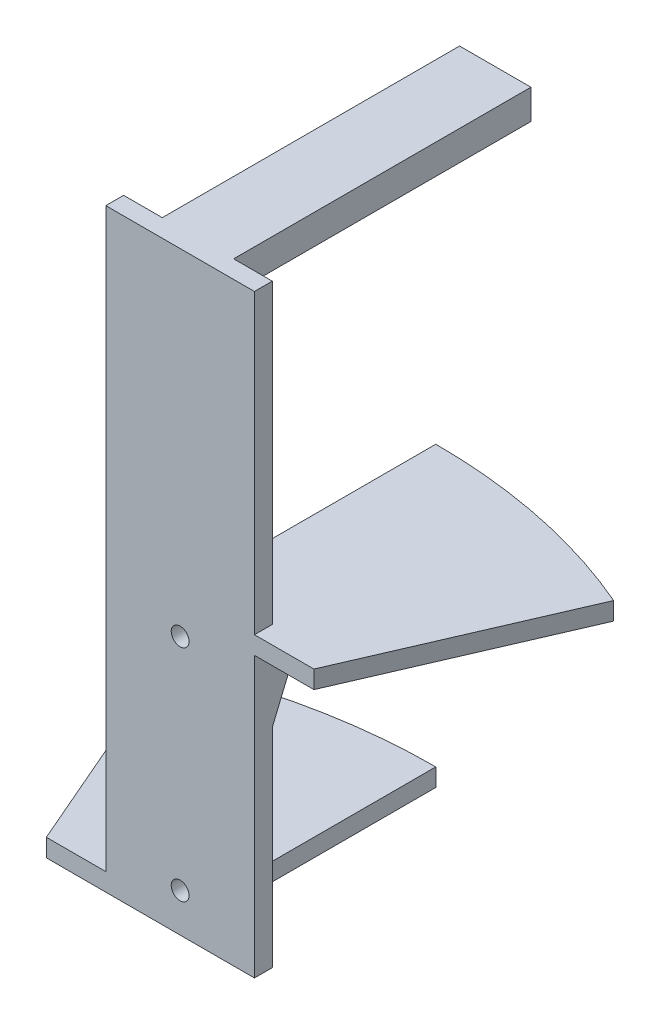
ISO-10303-21;
HEADER;
FILE_DESCRIPTION(('STEP AP214'),'2;1');
FILE_NAME('part.step','',(''),(''),'','','');
FILE_SCHEMA(('AUTOMOTIVE_DESIGN { 1 0 10303 214 1 1 1 1 }'));
ENDSEC;
DATA;
#1=APPLICATION_CONTEXT('core data for automotive mechanical design processes');
#2=APPLICATION_PROTOCOL_DEFINITION('international standard','automotive_design',2000,#1);
#3=PRODUCT_CONTEXT('',#1,'mechanical');
#4=PRODUCT('Part','Part','',(#3));
#5=PRODUCT_RELATED_PRODUCT_CATEGORY('part','',(#4));
#6=PRODUCT_DEFINITION_FORMATION('','',#4);
#7=PRODUCT_DEFINITION_CONTEXT('part definition',#1,'design');
#8=PRODUCT_DEFINITION('design','',#6,#7);
#9=PRODUCT_DEFINITION_SHAPE('','',#8);
#10=(LENGTH_UNIT() NAMED_UNIT(*) SI_UNIT(.MILLI.,.METRE.));
#11=(NAMED_UNIT(*) PLANE_ANGLE_UNIT() SI_UNIT($,.RADIAN.));
#12=(NAMED_UNIT(*) SI_UNIT($,.STERADIAN.) SOLID_ANGLE_UNIT());
#13=UNCERTAINTY_MEASURE_WITH_UNIT(LENGTH_MEASURE(1.E-05),#10,'distance_accuracy_value','');
#14=(GEOMETRIC_REPRESENTATION_CONTEXT(3) GLOBAL_UNCERTAINTY_ASSIGNED_CONTEXT((#13)) GLOBAL_UNIT_ASSIGNED_CONTEXT((#10,
#11,#12)) REPRESENTATION_CONTEXT('',''));
#15=CARTESIAN_POINT('',(0.,0.,0.));
#16=DIRECTION('',(0.,0.,1.));
#17=DIRECTION('',(1.,0.,0.));
#18=AXIS2_PLACEMENT_3D('',#15,#16,#17);
#19=CARTESIAN_POINT('',(0.,0.,0.));
#20=DIRECTION('',(0.,0.,-1.));
#21=DIRECTION('',(-1.,0.,0.));
#22=AXIS2_PLACEMENT_3D('',#19,#20,#21);
#23=PLANE('',#22);
#24=CARTESIAN_POINT('',(0.,18.5,0.));
#25=DIRECTION('',(0.,0.,1.));
#26=DIRECTION('',(1.,0.,0.));
#27=AXIS2_PLACEMENT_3D('',#24,#25,#26);
#28=CIRCLE('',#27,1.5);
#29=CARTESIAN_POINT('',(1.5,18.5,0.));
#30=VERTEX_POINT('',#29);
#31=EDGE_CURVE('E406',#30,#30,#28,.T.);
#32=ORIENTED_EDGE('',*,*,#31,.T.);
#33=EDGE_LOOP('',(#32));
#34=FACE_BOUND('',#33,.T.);
#35=CARTESIAN_POINT('',(0.,-18.5,0.));
#36=DIRECTION('',(0.,0.,1.));
#37=DIRECTION('',(-1.,0.,0.));
#38=AXIS2_PLACEMENT_3D('',#35,#36,#37);
#39=CIRCLE('',#38,1.5);
#40=CARTESIAN_POINT('',(-1.49999999999999,-18.5,0.));
#41=VERTEX_POINT('',#40);
#42=EDGE_CURVE('E402',#41,#41,#39,.T.);
#43=ORIENTED_EDGE('',*,*,#42,.T.);
#44=EDGE_LOOP('',(#43));
#45=FACE_BOUND('',#44,.T.);
#46=DIRECTION('',(-1.,0.,0.));
#47=VECTOR('',#46,1.);
#48=CARTESIAN_POINT('',(-6.,25.,0.));
#49=LINE('',#48,#47);
#50=CARTESIAN_POINT('',(-2.99999999999999,25.,0.));
#51=VERTEX_POINT('',#50);
#52=CARTESIAN_POINT('',(-6.,25.,0.));
#53=VERTEX_POINT('',#52);
#54=EDGE_CURVE('E240',#51,#53,#49,.T.);
#55=ORIENTED_EDGE('',*,*,#54,.F.);
#56=DIRECTION('',(0.,-1.,0.));
#57=VECTOR('',#56,1.);
#58=CARTESIAN_POINT('',(-3.,70.,0.));
#59=LINE('',#58,#57);
#60=CARTESIAN_POINT('',(-3.,70.,0.));
#61=VERTEX_POINT('',#60);
#62=EDGE_CURVE('E493',#61,#51,#59,.T.);
#63=ORIENTED_EDGE('',*,*,#62,.F.);
#64=DIRECTION('',(-1.,0.,0.));
#65=VECTOR('',#64,1.);
#66=CARTESIAN_POINT('',(6.,70.,0.));
#67=LINE('',#66,#65);
#68=CARTESIAN_POINT('',(3.,70.,0.));
#69=VERTEX_POINT('',#68);
#70=EDGE_CURVE('E245',#69,#61,#67,.T.);
#71=ORIENTED_EDGE('',*,*,#70,.F.);
#72=DIRECTION('',(0.,1.,0.));
#73=VECTOR('',#72,1.);
#74=CARTESIAN_POINT('',(3.,70.,0.));
#75=LINE('',#74,#73);
#76=CARTESIAN_POINT('',(2.99999999999999,25.,0.));
#77=VERTEX_POINT('',#76);
#78=EDGE_CURVE('E246',#77,#69,#75,.T.);
#79=ORIENTED_EDGE('',*,*,#78,.F.);
#80=DIRECTION('',(-1.,0.,0.));
#81=VECTOR('',#80,1.);
#82=CARTESIAN_POINT('',(12.5,25.,0.));
#83=LINE('',#82,#81);
#84=CARTESIAN_POINT('',(0.,25.,0.));
#85=VERTEX_POINT('',#84);
#86=EDGE_CURVE('E305',#77,#85,#83,.T.);
#87=ORIENTED_EDGE('',*,*,#86,.T.);
#88=DIRECTION('',(0.,1.,0.));
#89=VECTOR('',#88,1.);
#90=CARTESIAN_POINT('',(0.,22.,0.));
#91=LINE('',#90,#89);
#92=CARTESIAN_POINT('',(0.,22.,0.));
#93=VERTEX_POINT('',#92);
#94=EDGE_CURVE('E339',#93,#85,#91,.T.);
#95=ORIENTED_EDGE('',*,*,#94,.F.);
#96=DIRECTION('',(1.,0.,0.));
#97=VECTOR('',#96,1.);
#98=CARTESIAN_POINT('',(0.,22.,0.));
#99=LINE('',#98,#97);
#100=CARTESIAN_POINT('',(9.5,22.,0.));
#101=VERTEX_POINT('',#100);
#102=EDGE_CURVE('E399',#93,#101,#99,.T.);
#103=ORIENTED_EDGE('',*,*,#102,.T.);
#104=DIRECTION('',(0.,-1.,0.));
#105=VECTOR('',#104,1.);
#106=CARTESIAN_POINT('',(9.5,0.,0.));
#107=LINE('',#106,#105);
#108=CARTESIAN_POINT('',(9.5,10.,0.));
#109=VERTEX_POINT('',#108);
#110=EDGE_CURVE('E317',#101,#109,#107,.T.);
#111=ORIENTED_EDGE('',*,*,#110,.T.);
#112=DIRECTION('',(1.,0.,0.));
#113=VECTOR('',#112,1.);
#114=CARTESIAN_POINT('',(0.,10.,0.));
#115=LINE('',#114,#113);
#116=CARTESIAN_POINT('',(12.5,10.,0.));
#117=VERTEX_POINT('',#116);
#118=EDGE_CURVE('E321',#117,#109,#115,.F.);
#119=ORIENTED_EDGE('',*,*,#118,.F.);
#120=DIRECTION('',(0.,1.,0.));
#121=VECTOR('',#120,1.);
#122=CARTESIAN_POINT('',(12.5,25.,0.));
#123=LINE('',#122,#121);
#124=CARTESIAN_POINT('',(12.5,-25.,0.));
#125=VERTEX_POINT('',#124);
#126=EDGE_CURVE('E418',#125,#117,#123,.T.);
#127=ORIENTED_EDGE('',*,*,#126,.F.);
#128=DIRECTION('',(-1.,0.,0.));
#129=VECTOR('',#128,1.);
#130=CARTESIAN_POINT('',(0.,-25.,0.));
#131=LINE('',#130,#129);
#132=CARTESIAN_POINT('',(0.,-25.,0.));
#133=VERTEX_POINT('',#132);
#134=EDGE_CURVE('E348',#125,#133,#131,.T.);
#135=ORIENTED_EDGE('',*,*,#134,.T.);
#136=DIRECTION('',(0.,-1.,0.));
#137=VECTOR('',#136,1.);
#138=CARTESIAN_POINT('',(0.,-22.,0.));
#139=LINE('',#138,#137);
#140=CARTESIAN_POINT('',(0.,-22.,0.));
#141=VERTEX_POINT('',#140);
#142=EDGE_CURVE('E347',#141,#133,#139,.T.);
#143=ORIENTED_EDGE('',*,*,#142,.F.);
#144=DIRECTION('',(-1.,0.,0.));
#145=VECTOR('',#144,1.);
#146=CARTESIAN_POINT('',(0.,-22.,0.));
#147=LINE('',#146,#145);
#148=CARTESIAN_POINT('',(-9.5,-22.,0.));
#149=VERTEX_POINT('',#148);
#150=EDGE_CURVE('E374',#141,#149,#147,.T.);
#151=ORIENTED_EDGE('',*,*,#150,.T.);
#152=DIRECTION('',(0.,1.,0.));
#153=VECTOR('',#152,1.);
#154=CARTESIAN_POINT('',(-9.5,0.,0.));
#155=LINE('',#154,#153);
#156=CARTESIAN_POINT('',(-9.5,-10.,0.));
#157=VERTEX_POINT('',#156);
#158=EDGE_CURVE('E328',#149,#157,#155,.T.);
#159=ORIENTED_EDGE('',*,*,#158,.T.);
#160=DIRECTION('',(-1.,0.,0.));
#161=VECTOR('',#160,1.);
#162=CARTESIAN_POINT('',(0.,-10.,0.));
#163=LINE('',#162,#161);
#164=CARTESIAN_POINT('',(-12.5,-10.,0.));
#165=VERTEX_POINT('',#164);
#166=EDGE_CURVE('E332',#165,#157,#163,.F.);
#167=ORIENTED_EDGE('',*,*,#166,.F.);
#168=DIRECTION('',(0.,-1.,0.));
#169=VECTOR('',#168,1.);
#170=CARTESIAN_POINT('',(-12.5,25.,0.));
#171=LINE('',#170,#169);
#172=CARTESIAN_POINT('',(-12.5,75.,0.));
#173=VERTEX_POINT('',#172);
#174=EDGE_CURVE('E412',#173,#165,#171,.T.);
#175=ORIENTED_EDGE('',*,*,#174,.F.);
#176=DIRECTION('',(-1.,0.,0.));
#177=VECTOR('',#176,1.);
#178=CARTESIAN_POINT('',(12.5,75.,0.));
#179=LINE('',#178,#177);
#180=CARTESIAN_POINT('',(-5.99999999999999,75.,0.));
#181=VERTEX_POINT('',#180);
#182=EDGE_CURVE('E298',#181,#173,#179,.T.);
#183=ORIENTED_EDGE('',*,*,#182,.F.);
#184=DIRECTION('',(0.,1.,0.));
#185=VECTOR('',#184,1.);
#186=CARTESIAN_POINT('',(-5.99999999999999,75.,0.));
#187=LINE('',#186,#185);
#188=EDGE_CURVE('E272',#53,#181,#187,.T.);
#189=ORIENTED_EDGE('',*,*,#188,.F.);
#190=EDGE_LOOP('',(#55,#63,#71,#79,#87,#95,#103,#111,#119,#127,#135,#143,#151,#159,#167,#175,
#183,#189));
#191=FACE_BOUND('',#190,.T.);
#192=ADVANCED_FACE('F35',(#34,#45,#191),#23,.T.);
#193=CARTESIAN_POINT('',(6.,70.,-50.));
#194=DIRECTION('',(0.,1.,0.));
#195=DIRECTION('',(0.,0.,1.));
#196=AXIS2_PLACEMENT_3D('',#193,#194,#195);
#197=PLANE('',#196);
#198=DIRECTION('',(0.,0.,1.));
#199=VECTOR('',#198,1.);
#200=CARTESIAN_POINT('',(-3.,70.,-3.));
#201=LINE('',#200,#199);
#202=CARTESIAN_POINT('',(-3.,70.,-3.));
#203=VERTEX_POINT('',#202);
#204=EDGE_CURVE('E224',#203,#61,#201,.T.);
#205=ORIENTED_EDGE('',*,*,#204,.F.);
#206=DIRECTION('',(1.,0.,0.));
#207=VECTOR('',#206,1.);
#208=CARTESIAN_POINT('',(-6.,70.,-3.));
#209=LINE('',#208,#207);
#210=CARTESIAN_POINT('',(-6.,70.,-3.));
#211=VERTEX_POINT('',#210);
#212=EDGE_CURVE('E231',#211,#203,#209,.T.);
#213=ORIENTED_EDGE('',*,*,#212,.F.);
#214=DIRECTION('',(0.,0.,1.));
#215=VECTOR('',#214,1.);
#216=CARTESIAN_POINT('',(-5.99999999999999,70.,-50.));
#217=LINE('',#216,#215);
#218=CARTESIAN_POINT('',(-5.99999999999999,70.,-50.));
#219=VERTEX_POINT('',#218);
#220=EDGE_CURVE('E284',#219,#211,#217,.T.);
#221=ORIENTED_EDGE('',*,*,#220,.F.);
#222=DIRECTION('',(-1.,0.,0.));
#223=VECTOR('',#222,1.);
#224=CARTESIAN_POINT('',(6.,70.,-50.));
#225=LINE('',#224,#223);
#226=CARTESIAN_POINT('',(6.,70.,-50.));
#227=VERTEX_POINT('',#226);
#228=EDGE_CURVE('E271',#227,#219,#225,.T.);
#229=ORIENTED_EDGE('',*,*,#228,.F.);
#230=DIRECTION('',(0.,0.,1.));
#231=VECTOR('',#230,1.);
#232=CARTESIAN_POINT('',(6.,70.,-50.));
#233=LINE('',#232,#231);
#234=CARTESIAN_POINT('',(6.,70.,-3.));
#235=VERTEX_POINT('',#234);
#236=EDGE_CURVE('E286',#227,#235,#233,.T.);
#237=ORIENTED_EDGE('',*,*,#236,.T.);
#238=DIRECTION('',(1.,0.,0.));
#239=VECTOR('',#238,1.);
#240=CARTESIAN_POINT('',(6.,70.,-3.));
#241=LINE('',#240,#239);
#242=CARTESIAN_POINT('',(2.99999999999999,70.,-3.));
#243=VERTEX_POINT('',#242);
#244=EDGE_CURVE('E259',#243,#235,#241,.T.);
#245=ORIENTED_EDGE('',*,*,#244,.F.);
#246=DIRECTION('',(0.,0.,1.));
#247=VECTOR('',#246,1.);
#248=CARTESIAN_POINT('',(3.,70.,-3.));
#249=LINE('',#248,#247);
#250=EDGE_CURVE('E50',#243,#69,#249,.T.);
#251=ORIENTED_EDGE('',*,*,#250,.T.);
#252=ORIENTED_EDGE('',*,*,#70,.T.);
#253=EDGE_LOOP('',(#205,#213,#221,#229,#237,#245,#251,#252));
#254=FACE_BOUND('',#253,.T.);
#255=ADVANCED_FACE('F243',(#254),#197,.F.);
#256=CARTESIAN_POINT('',(12.5,25.,0.));
#257=VERTEX_POINT('',#256);
#258=CARTESIAN_POINT('',(6.,25.,0.));
#259=VERTEX_POINT('',#258);
#260=EDGE_CURVE('E294',#257,#259,#83,.T.);
#261=ORIENTED_EDGE('',*,*,#260,.T.);
#262=DIRECTION('',(0.,-1.,0.));
#263=VECTOR('',#262,1.);
#264=CARTESIAN_POINT('',(6.,75.,0.));
#265=LINE('',#264,#263);
#266=CARTESIAN_POINT('',(6.,75.,0.));
#267=VERTEX_POINT('',#266);
#268=EDGE_CURVE('E267',#267,#259,#265,.T.);
#269=ORIENTED_EDGE('',*,*,#268,.F.);
#270=CARTESIAN_POINT('',(12.5,75.,0.));
#271=VERTEX_POINT('',#270);
#272=EDGE_CURVE('E299',#271,#267,#179,.T.);
#273=ORIENTED_EDGE('',*,*,#272,.F.);
#274=DIRECTION('',(0.,-1.,0.));
#275=VECTOR('',#274,1.);
#276=CARTESIAN_POINT('',(12.5,75.,0.));
#277=LINE('',#276,#275);
#278=EDGE_CURVE('E302',#271,#257,#277,.T.);
#279=ORIENTED_EDGE('',*,*,#278,.T.);
#280=EDGE_LOOP('',(#261,#269,#273,#279));
#281=FACE_BOUND('',#280,.T.);
#282=ADVANCED_FACE('F540',(#281),#23,.T.);
#283=CARTESIAN_POINT('',(12.5,25.,3.));
#284=DIRECTION('',(0.,-1.,0.));
#285=DIRECTION('',(1.,0.,0.));
#286=AXIS2_PLACEMENT_3D('',#283,#284,#285);
#287=PLANE('',#286);
#288=DIRECTION('',(0.,0.,1.));
#289=VECTOR('',#288,1.);
#290=CARTESIAN_POINT('',(6.,25.,-3.));
#291=LINE('',#290,#289);
#292=CARTESIAN_POINT('',(6.,25.,-3.));
#293=VERTEX_POINT('',#292);
#294=EDGE_CURVE('E264',#293,#259,#291,.T.);
#295=ORIENTED_EDGE('',*,*,#294,.T.);
#296=ORIENTED_EDGE('',*,*,#260,.F.);
#297=DIRECTION('',(0.,0.,-1.));
#298=VECTOR('',#297,1.);
#299=CARTESIAN_POINT('',(12.5,25.,0.));
#300=LINE('',#299,#298);
#301=CARTESIAN_POINT('',(12.5,25.,3.));
#302=VERTEX_POINT('',#301);
#303=EDGE_CURVE('E289',#302,#257,#300,.T.);
#304=ORIENTED_EDGE('',*,*,#303,.F.);
#305=DIRECTION('',(-1.,0.,0.));
#306=VECTOR('',#305,1.);
#307=CARTESIAN_POINT('',(12.5,25.,3.));
#308=LINE('',#307,#306);
#309=CARTESIAN_POINT('',(22.5,25.,2.99999999999999));
#310=VERTEX_POINT('',#309);
#311=EDGE_CURVE('E422',#310,#302,#308,.T.);
#312=ORIENTED_EDGE('',*,*,#311,.F.);
#313=DIRECTION('',(0.397112073095543,0.,-0.917770124487478));
#314=VECTOR('',#313,1.);
#315=CARTESIAN_POINT('',(22.5,25.,2.99999999999999));
#316=LINE('',#315,#314);
#317=CARTESIAN_POINT('',(37.7256469440766,25.,-32.1881618263104));
#318=VERTEX_POINT('',#317);
#319=EDGE_CURVE('E380',#310,#318,#316,.T.);
#320=ORIENTED_EDGE('',*,*,#319,.T.);
#321=CARTESIAN_POINT('',(0.,25.,55.));
#322=DIRECTION('',(0.,1.,0.));
#323=DIRECTION('',(0.,0.,1.));
#324=AXIS2_PLACEMENT_3D('',#321,#322,#323);
#325=CIRCLE('',#324,95.);
#326=CARTESIAN_POINT('',(0.,25.,-40.));
#327=VERTEX_POINT('',#326);
#328=EDGE_CURVE('E383',#318,#327,#325,.T.);
#329=ORIENTED_EDGE('',*,*,#328,.T.);
#330=DIRECTION('',(0.,0.,-1.));
#331=VECTOR('',#330,1.);
#332=CARTESIAN_POINT('',(0.,25.,0.));
#333=LINE('',#332,#331);
#334=EDGE_CURVE('E335',#85,#327,#333,.T.);
#335=ORIENTED_EDGE('',*,*,#334,.F.);
#336=ORIENTED_EDGE('',*,*,#86,.F.);
#337=DIRECTION('',(0.,0.,1.));
#338=VECTOR('',#337,1.);
#339=CARTESIAN_POINT('',(2.99999999999999,25.,-3.));
#340=LINE('',#339,#338);
#341=CARTESIAN_POINT('',(2.99999999999999,25.,-3.));
#342=VERTEX_POINT('',#341);
#343=EDGE_CURVE('E262',#342,#77,#340,.T.);
#344=ORIENTED_EDGE('',*,*,#343,.F.);
#345=DIRECTION('',(-1.,0.,0.));
#346=VECTOR('',#345,1.);
#347=CARTESIAN_POINT('',(6.,25.,-3.));
#348=LINE('',#347,#346);
#349=EDGE_CURVE('E255',#293,#342,#348,.T.);
#350=ORIENTED_EDGE('',*,*,#349,.F.);
#351=EDGE_LOOP('',(#295,#296,#304,#312,#320,#329,#335,#336,#344,#350));
#352=FACE_BOUND('',#351,.T.);
#353=ADVANCED_FACE('F504',(#352),#287,.F.);
#354=CARTESIAN_POINT('',(-12.5,25.,3.));
#355=DIRECTION('',(1.,0.,0.));
#356=DIRECTION('',(0.,1.,0.));
#357=AXIS2_PLACEMENT_3D('',#354,#355,#356);
#358=PLANE('',#357);
#359=ORIENTED_EDGE('',*,*,#174,.T.);
#360=DIRECTION('',(0.,0.923076923076923,0.384615384615385));
#361=VECTOR('',#360,1.);
#362=CARTESIAN_POINT('',(-12.5,-22.,-5.));
#363=LINE('',#362,#361);
#364=CARTESIAN_POINT('',(-12.5,-22.,-5.));
#365=VERTEX_POINT('',#364);
#366=EDGE_CURVE('E325',#365,#165,#363,.T.);
#367=ORIENTED_EDGE('',*,*,#366,.F.);
#368=DIRECTION('',(0.,0.,-1.));
#369=VECTOR('',#368,1.);
#370=CARTESIAN_POINT('',(-12.5,-22.,3.));
#371=LINE('',#370,#369);
#372=CARTESIAN_POINT('',(-12.5,-22.,3.));
#373=VERTEX_POINT('',#372);
#374=EDGE_CURVE('E377',#373,#365,#371,.T.);
#375=ORIENTED_EDGE('',*,*,#374,.F.);
#376=DIRECTION('',(0.,-1.,0.));
#377=VECTOR('',#376,1.);
#378=CARTESIAN_POINT('',(-12.5,25.,3.));
#379=LINE('',#378,#377);
#380=CARTESIAN_POINT('',(-12.5,75.,3.));
#381=VERTEX_POINT('',#380);
#382=EDGE_CURVE('E415',#381,#373,#379,.T.);
#383=ORIENTED_EDGE('',*,*,#382,.F.);
#384=DIRECTION('',(0.,0.,1.));
#385=VECTOR('',#384,1.);
#386=CARTESIAN_POINT('',(-12.5,75.,0.));
#387=LINE('',#386,#385);
#388=EDGE_CURVE('E290',#173,#381,#387,.T.);
#389=ORIENTED_EDGE('',*,*,#388,.F.);
#390=EDGE_LOOP('',(#359,#367,#375,#383,#389));
#391=FACE_BOUND('',#390,.T.);
#392=ADVANCED_FACE('F37',(#391),#358,.F.);
#393=CARTESIAN_POINT('',(12.5,25.,3.));
#394=DIRECTION('',(-1.,0.,0.));
#395=DIRECTION('',(0.,-1.,0.));
#396=AXIS2_PLACEMENT_3D('',#393,#394,#395);
#397=PLANE('',#396);
#398=ORIENTED_EDGE('',*,*,#126,.T.);
#399=DIRECTION('',(0.,-0.923076923076923,0.384615384615385));
#400=VECTOR('',#399,1.);
#401=CARTESIAN_POINT('',(12.5,22.,-5.));
#402=LINE('',#401,#400);
#403=CARTESIAN_POINT('',(12.5,22.,-5.));
#404=VERTEX_POINT('',#403);
#405=EDGE_CURVE('E314',#404,#117,#402,.T.);
#406=ORIENTED_EDGE('',*,*,#405,.F.);
#407=DIRECTION('',(0.,0.,-1.));
#408=VECTOR('',#407,1.);
#409=CARTESIAN_POINT('',(12.5,22.,3.));
#410=LINE('',#409,#408);
#411=CARTESIAN_POINT('',(12.5,22.,3.));
#412=VERTEX_POINT('',#411);
#413=EDGE_CURVE('E425',#412,#404,#410,.T.);
#414=ORIENTED_EDGE('',*,*,#413,.F.);
#415=DIRECTION('',(0.,1.,0.));
#416=VECTOR('',#415,1.);
#417=CARTESIAN_POINT('',(12.5,25.,3.));
#418=LINE('',#417,#416);
#419=CARTESIAN_POINT('',(12.5,-25.,3.));
#420=VERTEX_POINT('',#419);
#421=EDGE_CURVE('E420',#420,#412,#418,.T.);
#422=ORIENTED_EDGE('',*,*,#421,.F.);
#423=DIRECTION('',(0.,0.,-1.));
#424=VECTOR('',#423,1.);
#425=CARTESIAN_POINT('',(12.5,-25.,0.));
#426=LINE('',#425,#424);
#427=EDGE_CURVE('E350',#420,#125,#426,.T.);
#428=ORIENTED_EDGE('',*,*,#427,.T.);
#429=EDGE_LOOP('',(#398,#406,#414,#422,#428));
#430=FACE_BOUND('',#429,.T.);
#431=ADVANCED_FACE('F454',(#430),#397,.F.);
#432=CARTESIAN_POINT('',(0.,0.,3.));
#433=DIRECTION('',(0.,0.,-1.));
#434=DIRECTION('',(-1.,0.,0.));
#435=AXIS2_PLACEMENT_3D('',#432,#433,#434);
#436=PLANE('',#435);
#437=ORIENTED_EDGE('',*,*,#421,.T.);
#438=DIRECTION('',(1.,0.,0.));
#439=VECTOR('',#438,1.);
#440=CARTESIAN_POINT('',(-22.5,22.,3.));
#441=LINE('',#440,#439);
#442=CARTESIAN_POINT('',(22.5,22.,2.99999999999999));
#443=VERTEX_POINT('',#442);
#444=EDGE_CURVE('E384',#412,#443,#441,.T.);
#445=ORIENTED_EDGE('',*,*,#444,.T.);
#446=DIRECTION('',(0.,-1.,0.));
#447=VECTOR('',#446,1.);
#448=CARTESIAN_POINT('',(22.5,25.,2.99999999999999));
#449=LINE('',#448,#447);
#450=EDGE_CURVE('E387',#310,#443,#449,.T.);
#451=ORIENTED_EDGE('',*,*,#450,.F.);
#452=ORIENTED_EDGE('',*,*,#311,.T.);
#453=DIRECTION('',(0.,-1.,0.));
#454=VECTOR('',#453,1.);
#455=CARTESIAN_POINT('',(12.5,75.,3.));
#456=LINE('',#455,#454);
#457=CARTESIAN_POINT('',(12.5,75.,3.));
#458=VERTEX_POINT('',#457);
#459=EDGE_CURVE('E310',#458,#302,#456,.T.);
#460=ORIENTED_EDGE('',*,*,#459,.F.);
#461=DIRECTION('',(1.,0.,0.));
#462=VECTOR('',#461,1.);
#463=CARTESIAN_POINT('',(-12.5,75.,3.));
#464=LINE('',#463,#462);
#465=EDGE_CURVE('E293',#381,#458,#464,.T.);
#466=ORIENTED_EDGE('',*,*,#465,.F.);
#467=ORIENTED_EDGE('',*,*,#382,.T.);
#468=DIRECTION('',(1.,0.,0.));
#469=VECTOR('',#468,1.);
#470=CARTESIAN_POINT('',(-22.5,-22.,3.));
#471=LINE('',#470,#469);
#472=CARTESIAN_POINT('',(-22.5,-22.,3.));
#473=VERTEX_POINT('',#472);
#474=EDGE_CURVE('E356',#473,#373,#471,.T.);
#475=ORIENTED_EDGE('',*,*,#474,.F.);
#476=DIRECTION('',(0.,1.,0.));
#477=VECTOR('',#476,1.);
#478=CARTESIAN_POINT('',(-22.5,-25.,3.));
#479=LINE('',#478,#477);
#480=CARTESIAN_POINT('',(-22.5,-25.,3.));
#481=VERTEX_POINT('',#480);
#482=EDGE_CURVE('E372',#481,#473,#479,.T.);
#483=ORIENTED_EDGE('',*,*,#482,.F.);
#484=DIRECTION('',(1.,0.,0.));
#485=VECTOR('',#484,1.);
#486=CARTESIAN_POINT('',(12.5,-25.,3.));
#487=LINE('',#486,#485);
#488=EDGE_CURVE('E417',#481,#420,#487,.T.);
#489=ORIENTED_EDGE('',*,*,#488,.T.);
#490=EDGE_LOOP('',(#437,#445,#451,#452,#460,#466,#467,#475,#483,#489));
#491=FACE_BOUND('',#490,.T.);
#492=CARTESIAN_POINT('',(0.,18.5,3.));
#493=DIRECTION('',(0.,0.,1.));
#494=DIRECTION('',(1.,0.,0.));
#495=AXIS2_PLACEMENT_3D('',#492,#493,#494);
#496=CIRCLE('',#495,1.5);
#497=CARTESIAN_POINT('',(1.5,18.5,3.));
#498=VERTEX_POINT('',#497);
#499=EDGE_CURVE('E409',#498,#498,#496,.T.);
#500=ORIENTED_EDGE('',*,*,#499,.F.);
#501=EDGE_LOOP('',(#500));
#502=FACE_BOUND('',#501,.T.);
#503=CARTESIAN_POINT('',(0.,-18.5,3.));
#504=DIRECTION('',(0.,0.,1.));
#505=DIRECTION('',(-1.,0.,0.));
#506=AXIS2_PLACEMENT_3D('',#503,#504,#505);
#507=CIRCLE('',#506,1.5);
#508=CARTESIAN_POINT('',(-1.49999999999999,-18.5,3.));
#509=VERTEX_POINT('',#508);
#510=EDGE_CURVE('E403',#509,#509,#507,.T.);
#511=ORIENTED_EDGE('',*,*,#510,.F.);
#512=EDGE_LOOP('',(#511));
#513=FACE_BOUND('',#512,.T.);
#514=ADVANCED_FACE('F520',(#491,#502,#513),#436,.F.);
#515=CARTESIAN_POINT('',(12.5,-25.,3.));
#516=DIRECTION('',(0.,1.,0.));
#517=DIRECTION('',(0.,0.,1.));
#518=AXIS2_PLACEMENT_3D('',#515,#516,#517);
#519=PLANE('',#518);
#520=ORIENTED_EDGE('',*,*,#427,.F.);
#521=ORIENTED_EDGE('',*,*,#488,.F.);
#522=DIRECTION('',(0.397112073095543,0.,0.917770124487478));
#523=VECTOR('',#522,1.);
#524=CARTESIAN_POINT('',(-22.5,-25.,3.));
#525=LINE('',#524,#523);
#526=CARTESIAN_POINT('',(-37.7256469440766,-25.,-32.1881618263104));
#527=VERTEX_POINT('',#526);
#528=EDGE_CURVE('E357',#527,#481,#525,.T.);
#529=ORIENTED_EDGE('',*,*,#528,.F.);
#530=CARTESIAN_POINT('',(0.,-25.,55.));
#531=DIRECTION('',(0.,1.,0.));
#532=DIRECTION('',(0.,0.,1.));
#533=AXIS2_PLACEMENT_3D('',#530,#531,#532);
#534=CIRCLE('',#533,95.);
#535=CARTESIAN_POINT('',(0.,-25.,-40.));
#536=VERTEX_POINT('',#535);
#537=EDGE_CURVE('E360',#536,#527,#534,.T.);
#538=ORIENTED_EDGE('',*,*,#537,.F.);
#539=DIRECTION('',(0.,0.,-1.));
#540=VECTOR('',#539,1.);
#541=CARTESIAN_POINT('',(0.,-25.,0.));
#542=LINE('',#541,#540);
#543=EDGE_CURVE('E343',#133,#536,#542,.T.);
#544=ORIENTED_EDGE('',*,*,#543,.F.);
#545=ORIENTED_EDGE('',*,*,#134,.F.);
#546=EDGE_LOOP('',(#520,#521,#529,#538,#544,#545));
#547=FACE_BOUND('',#546,.T.);
#548=ADVANCED_FACE('F461',(#547),#519,.F.);
#549=CARTESIAN_POINT('',(0.,18.5,3.));
#550=DIRECTION('',(0.,0.,-1.));
#551=DIRECTION('',(-1.,0.,0.));
#552=AXIS2_PLACEMENT_3D('',#549,#550,#551);
#553=CYLINDRICAL_SURFACE('',#552,1.5);
#554=ORIENTED_EDGE('',*,*,#499,.T.);
#555=EDGE_LOOP('',(#554));
#556=FACE_BOUND('',#555,.T.);
#557=ORIENTED_EDGE('',*,*,#31,.F.);
#558=EDGE_LOOP('',(#557));
#559=FACE_BOUND('',#558,.T.);
#560=ADVANCED_FACE('F582',(#556,#559),#553,.F.);
#561=CARTESIAN_POINT('',(0.,-18.5,3.));
#562=DIRECTION('',(0.,0.,-1.));
#563=DIRECTION('',(-1.,0.,0.));
#564=AXIS2_PLACEMENT_3D('',#561,#562,#563);
#565=CYLINDRICAL_SURFACE('',#564,1.5);
#566=ORIENTED_EDGE('',*,*,#510,.T.);
#567=EDGE_LOOP('',(#566));
#568=FACE_BOUND('',#567,.T.);
#569=ORIENTED_EDGE('',*,*,#42,.F.);
#570=EDGE_LOOP('',(#569));
#571=FACE_BOUND('',#570,.T.);
#572=ADVANCED_FACE('F586',(#568,#571),#565,.F.);
#573=CARTESIAN_POINT('',(0.,22.,55.));
#574=DIRECTION('',(0.,1.,0.));
#575=DIRECTION('',(0.,0.,1.));
#576=AXIS2_PLACEMENT_3D('',#573,#574,#575);
#577=PLANE('',#576);
#578=ORIENTED_EDGE('',*,*,#413,.T.);
#579=DIRECTION('',(1.,0.,0.));
#580=VECTOR('',#579,1.);
#581=CARTESIAN_POINT('',(0.,22.,-5.));
#582=LINE('',#581,#580);
#583=CARTESIAN_POINT('',(9.5,22.,-5.));
#584=VERTEX_POINT('',#583);
#585=EDGE_CURVE('E11',#404,#584,#582,.F.);
#586=ORIENTED_EDGE('',*,*,#585,.T.);
#587=DIRECTION('',(0.,0.,-1.));
#588=VECTOR('',#587,1.);
#589=CARTESIAN_POINT('',(9.5,22.,55.));
#590=LINE('',#589,#588);
#591=EDGE_CURVE('E43',#101,#584,#590,.T.);
#592=ORIENTED_EDGE('',*,*,#591,.F.);
#593=ORIENTED_EDGE('',*,*,#102,.F.);
#594=DIRECTION('',(0.,0.,-1.));
#595=VECTOR('',#594,1.);
#596=CARTESIAN_POINT('',(0.,22.,0.));
#597=LINE('',#596,#595);
#598=CARTESIAN_POINT('',(0.,22.,-40.));
#599=VERTEX_POINT('',#598);
#600=EDGE_CURVE('E336',#93,#599,#597,.T.);
#601=ORIENTED_EDGE('',*,*,#600,.T.);
#602=CARTESIAN_POINT('',(0.,22.,55.));
#603=DIRECTION('',(0.,1.,0.));
#604=DIRECTION('',(0.,0.,1.));
#605=AXIS2_PLACEMENT_3D('',#602,#603,#604);
#606=CIRCLE('',#605,95.);
#607=CARTESIAN_POINT('',(37.7256469440766,22.,-32.1881618263104));
#608=VERTEX_POINT('',#607);
#609=EDGE_CURVE('E390',#608,#599,#606,.T.);
#610=ORIENTED_EDGE('',*,*,#609,.F.);
#611=DIRECTION('',(0.397112073095543,0.,-0.917770124487478));
#612=VECTOR('',#611,1.);
#613=CARTESIAN_POINT('',(22.5,22.,2.99999999999999));
#614=LINE('',#613,#612);
#615=EDGE_CURVE('E379',#443,#608,#614,.T.);
#616=ORIENTED_EDGE('',*,*,#615,.F.);
#617=ORIENTED_EDGE('',*,*,#444,.F.);
#618=EDGE_LOOP('',(#578,#586,#592,#593,#601,#610,#616,#617));
#619=FACE_BOUND('',#618,.T.);
#620=ADVANCED_FACE('F513',(#619),#577,.F.);
#621=CARTESIAN_POINT('',(22.5,25.,2.99999999999999));
#622=DIRECTION('',(-0.917770124487477,0.,-0.397112073095543));
#623=DIRECTION('',(-0.397112073095543,0.,0.917770124487478));
#624=AXIS2_PLACEMENT_3D('',#621,#622,#623);
#625=PLANE('',#624);
#626=ORIENTED_EDGE('',*,*,#615,.T.);
#627=DIRECTION('',(0.,-1.,0.));
#628=VECTOR('',#627,1.);
#629=CARTESIAN_POINT('',(37.7256469440766,25.,-32.1881618263104));
#630=LINE('',#629,#628);
#631=EDGE_CURVE('E396',#318,#608,#630,.T.);
#632=ORIENTED_EDGE('',*,*,#631,.F.);
#633=ORIENTED_EDGE('',*,*,#319,.F.);
#634=ORIENTED_EDGE('',*,*,#450,.T.);
#635=EDGE_LOOP('',(#626,#632,#633,#634));
#636=FACE_BOUND('',#635,.T.);
#637=ADVANCED_FACE('F516',(#636),#625,.F.);
#638=CARTESIAN_POINT('',(0.,25.,55.));
#639=DIRECTION('',(0.,-1.,0.));
#640=DIRECTION('',(0.,0.,-1.));
#641=AXIS2_PLACEMENT_3D('',#638,#639,#640);
#642=CYLINDRICAL_SURFACE('',#641,95.);
#643=ORIENTED_EDGE('',*,*,#609,.T.);
#644=DIRECTION('',(0.,-1.,0.));
#645=VECTOR('',#644,1.);
#646=CARTESIAN_POINT('',(0.,25.,-40.));
#647=LINE('',#646,#645);
#648=EDGE_CURVE('E433',#599,#327,#647,.F.);
#649=ORIENTED_EDGE('',*,*,#648,.T.);
#650=ORIENTED_EDGE('',*,*,#328,.F.);
#651=ORIENTED_EDGE('',*,*,#631,.T.);
#652=EDGE_LOOP('',(#643,#649,#650,#651));
#653=FACE_BOUND('',#652,.T.);
#654=ADVANCED_FACE('F510',(#653),#642,.T.);
#655=CARTESIAN_POINT('',(0.,-22.,55.));
#656=DIRECTION('',(0.,-1.,0.));
#657=DIRECTION('',(0.,0.,1.));
#658=AXIS2_PLACEMENT_3D('',#655,#656,#657);
#659=PLANE('',#658);
#660=ORIENTED_EDGE('',*,*,#374,.T.);
#661=DIRECTION('',(-1.,0.,0.));
#662=VECTOR('',#661,1.);
#663=CARTESIAN_POINT('',(0.,-22.,-5.));
#664=LINE('',#663,#662);
#665=CARTESIAN_POINT('',(-9.5,-22.,-5.));
#666=VERTEX_POINT('',#665);
#667=EDGE_CURVE('E439',#365,#666,#664,.F.);
#668=ORIENTED_EDGE('',*,*,#667,.T.);
#669=DIRECTION('',(0.,0.,-1.));
#670=VECTOR('',#669,1.);
#671=CARTESIAN_POINT('',(-9.5,-22.,55.));
#672=LINE('',#671,#670);
#673=EDGE_CURVE('E436',#149,#666,#672,.T.);
#674=ORIENTED_EDGE('',*,*,#673,.F.);
#675=ORIENTED_EDGE('',*,*,#150,.F.);
#676=DIRECTION('',(0.,0.,-1.));
#677=VECTOR('',#676,1.);
#678=CARTESIAN_POINT('',(0.,-22.,0.));
#679=LINE('',#678,#677);
#680=CARTESIAN_POINT('',(0.,-22.,-40.));
#681=VERTEX_POINT('',#680);
#682=EDGE_CURVE('E344',#141,#681,#679,.T.);
#683=ORIENTED_EDGE('',*,*,#682,.T.);
#684=CARTESIAN_POINT('',(0.,-22.,55.));
#685=DIRECTION('',(0.,1.,0.));
#686=DIRECTION('',(0.,0.,1.));
#687=AXIS2_PLACEMENT_3D('',#684,#685,#686);
#688=CIRCLE('',#687,95.);
#689=CARTESIAN_POINT('',(-37.7256469440766,-22.,-32.1881618263104));
#690=VERTEX_POINT('',#689);
#691=EDGE_CURVE('E361',#681,#690,#688,.T.);
#692=ORIENTED_EDGE('',*,*,#691,.T.);
#693=DIRECTION('',(0.397112073095543,0.,0.917770124487478));
#694=VECTOR('',#693,1.);
#695=CARTESIAN_POINT('',(-22.5,-22.,3.));
#696=LINE('',#695,#694);
#697=EDGE_CURVE('E366',#690,#473,#696,.T.);
#698=ORIENTED_EDGE('',*,*,#697,.T.);
#699=ORIENTED_EDGE('',*,*,#474,.T.);
#700=EDGE_LOOP('',(#660,#668,#674,#675,#683,#692,#698,#699));
#701=FACE_BOUND('',#700,.T.);
#702=ADVANCED_FACE('F471',(#701),#659,.F.);
#703=CARTESIAN_POINT('',(-22.5,-25.,3.));
#704=DIRECTION('',(-0.917770124487477,0.,0.397112073095543));
#705=DIRECTION('',(0.397112073095543,0.,0.917770124487478));
#706=AXIS2_PLACEMENT_3D('',#703,#704,#705);
#707=PLANE('',#706);
#708=ORIENTED_EDGE('',*,*,#697,.F.);
#709=DIRECTION('',(0.,1.,0.));
#710=VECTOR('',#709,1.);
#711=CARTESIAN_POINT('',(-37.7256469440766,-25.,-32.1881618263104));
#712=LINE('',#711,#710);
#713=EDGE_CURVE('E363',#527,#690,#712,.T.);
#714=ORIENTED_EDGE('',*,*,#713,.F.);
#715=ORIENTED_EDGE('',*,*,#528,.T.);
#716=ORIENTED_EDGE('',*,*,#482,.T.);
#717=EDGE_LOOP('',(#708,#714,#715,#716));
#718=FACE_BOUND('',#717,.T.);
#719=ADVANCED_FACE('F528',(#718),#707,.T.);
#720=CARTESIAN_POINT('',(0.,-25.,55.));
#721=DIRECTION('',(0.,1.,0.));
#722=DIRECTION('',(0.,0.,1.));
#723=AXIS2_PLACEMENT_3D('',#720,#721,#722);
#724=CYLINDRICAL_SURFACE('',#723,95.);
#725=DIRECTION('',(0.,1.,0.));
#726=VECTOR('',#725,1.);
#727=CARTESIAN_POINT('',(0.,-25.,-40.));
#728=LINE('',#727,#726);
#729=EDGE_CURVE('E431',#536,#681,#728,.T.);
#730=ORIENTED_EDGE('',*,*,#729,.F.);
#731=ORIENTED_EDGE('',*,*,#537,.T.);
#732=ORIENTED_EDGE('',*,*,#713,.T.);
#733=ORIENTED_EDGE('',*,*,#691,.F.);
#734=EDGE_LOOP('',(#730,#731,#732,#733));
#735=FACE_BOUND('',#734,.T.);
#736=ADVANCED_FACE('F530',(#735),#724,.T.);
#737=CARTESIAN_POINT('',(0.,-22.,0.));
#738=DIRECTION('',(-1.,0.,0.));
#739=DIRECTION('',(0.,0.,1.));
#740=AXIS2_PLACEMENT_3D('',#737,#738,#739);
#741=PLANE('',#740);
#742=ORIENTED_EDGE('',*,*,#729,.T.);
#743=ORIENTED_EDGE('',*,*,#682,.F.);
#744=ORIENTED_EDGE('',*,*,#142,.T.);
#745=ORIENTED_EDGE('',*,*,#543,.T.);
#746=EDGE_LOOP('',(#742,#743,#744,#745));
#747=FACE_BOUND('',#746,.T.);
#748=ADVANCED_FACE('F467',(#747),#741,.F.);
#749=CARTESIAN_POINT('',(0.,22.,0.));
#750=DIRECTION('',(1.,0.,0.));
#751=DIRECTION('',(0.,1.,0.));
#752=AXIS2_PLACEMENT_3D('',#749,#750,#751);
#753=PLANE('',#752);
#754=ORIENTED_EDGE('',*,*,#600,.F.);
#755=ORIENTED_EDGE('',*,*,#94,.T.);
#756=ORIENTED_EDGE('',*,*,#334,.T.);
#757=ORIENTED_EDGE('',*,*,#648,.F.);
#758=EDGE_LOOP('',(#754,#755,#756,#757));
#759=FACE_BOUND('',#758,.T.);
#760=ADVANCED_FACE('F508',(#759),#753,.F.);
#761=CARTESIAN_POINT('',(-12.5,-22.,-5.));
#762=DIRECTION('',(0.,-0.384615384615385,0.923076923076923));
#763=DIRECTION('',(0.,0.923076923076923,0.384615384615385));
#764=AXIS2_PLACEMENT_3D('',#761,#762,#763);
#765=PLANE('',#764);
#766=ORIENTED_EDGE('',*,*,#366,.T.);
#767=ORIENTED_EDGE('',*,*,#166,.T.);
#768=DIRECTION('',(0.,0.923076923076923,0.384615384615385));
#769=VECTOR('',#768,1.);
#770=CARTESIAN_POINT('',(-9.5,-22.,-5.));
#771=LINE('',#770,#769);
#772=EDGE_CURVE('E324',#666,#157,#771,.T.);
#773=ORIENTED_EDGE('',*,*,#772,.F.);
#774=ORIENTED_EDGE('',*,*,#667,.F.);
#775=EDGE_LOOP('',(#766,#767,#773,#774));
#776=FACE_BOUND('',#775,.T.);
#777=ADVANCED_FACE('F477',(#776),#765,.F.);
#778=CARTESIAN_POINT('',(-9.5,0.,-18.5));
#779=DIRECTION('',(-1.,0.,0.));
#780=DIRECTION('',(0.,-1.,0.));
#781=AXIS2_PLACEMENT_3D('',#778,#779,#780);
#782=PLANE('',#781);
#783=ORIENTED_EDGE('',*,*,#158,.F.);
#784=ORIENTED_EDGE('',*,*,#673,.T.);
#785=ORIENTED_EDGE('',*,*,#772,.T.);
#786=EDGE_LOOP('',(#783,#784,#785));
#787=FACE_BOUND('',#786,.T.);
#788=ADVANCED_FACE('F475',(#787),#782,.F.);
#789=CARTESIAN_POINT('',(12.5,22.,-5.));
#790=DIRECTION('',(0.,0.384615384615385,0.923076923076923));
#791=DIRECTION('',(0.,-0.923076923076923,0.384615384615385));
#792=AXIS2_PLACEMENT_3D('',#789,#790,#791);
#793=PLANE('',#792);
#794=ORIENTED_EDGE('',*,*,#405,.T.);
#795=ORIENTED_EDGE('',*,*,#118,.T.);
#796=DIRECTION('',(0.,-0.923076923076923,0.384615384615385));
#797=VECTOR('',#796,1.);
#798=CARTESIAN_POINT('',(9.5,22.,-5.));
#799=LINE('',#798,#797);
#800=EDGE_CURVE('E313',#584,#109,#799,.T.);
#801=ORIENTED_EDGE('',*,*,#800,.F.);
#802=ORIENTED_EDGE('',*,*,#585,.F.);
#803=EDGE_LOOP('',(#794,#795,#801,#802));
#804=FACE_BOUND('',#803,.T.);
#805=ADVANCED_FACE('F449',(#804),#793,.F.);
#806=CARTESIAN_POINT('',(9.5,0.,-18.5));
#807=DIRECTION('',(1.,0.,0.));
#808=DIRECTION('',(0.,1.,0.));
#809=AXIS2_PLACEMENT_3D('',#806,#807,#808);
#810=PLANE('',#809);
#811=ORIENTED_EDGE('',*,*,#110,.F.);
#812=ORIENTED_EDGE('',*,*,#591,.T.);
#813=ORIENTED_EDGE('',*,*,#800,.T.);
#814=EDGE_LOOP('',(#811,#812,#813));
#815=FACE_BOUND('',#814,.T.);
#816=ADVANCED_FACE('F444',(#815),#810,.F.);
#817=CARTESIAN_POINT('',(12.5,75.,0.));
#818=DIRECTION('',(-1.,0.,0.));
#819=DIRECTION('',(0.,-1.,0.));
#820=AXIS2_PLACEMENT_3D('',#817,#818,#819);
#821=PLANE('',#820);
#822=ORIENTED_EDGE('',*,*,#303,.T.);
#823=ORIENTED_EDGE('',*,*,#278,.F.);
#824=DIRECTION('',(0.,0.,-1.));
#825=VECTOR('',#824,1.);
#826=CARTESIAN_POINT('',(12.5,75.,0.));
#827=LINE('',#826,#825);
#828=EDGE_CURVE('E296',#458,#271,#827,.T.);
#829=ORIENTED_EDGE('',*,*,#828,.F.);
#830=ORIENTED_EDGE('',*,*,#459,.T.);
#831=EDGE_LOOP('',(#822,#823,#829,#830));
#832=FACE_BOUND('',#831,.T.);
#833=ADVANCED_FACE('F534',(#832),#821,.F.);
#834=CARTESIAN_POINT('',(0.,75.,0.));
#835=DIRECTION('',(0.,1.,0.));
#836=DIRECTION('',(0.,0.,1.));
#837=AXIS2_PLACEMENT_3D('',#834,#835,#836);
#838=PLANE('',#837);
#839=ORIENTED_EDGE('',*,*,#388,.T.);
#840=ORIENTED_EDGE('',*,*,#465,.T.);
#841=ORIENTED_EDGE('',*,*,#828,.T.);
#842=ORIENTED_EDGE('',*,*,#272,.T.);
#843=DIRECTION('',(0.,0.,1.));
#844=VECTOR('',#843,1.);
#845=CARTESIAN_POINT('',(6.,75.,-50.));
#846=LINE('',#845,#844);
#847=CARTESIAN_POINT('',(6.,75.,-50.));
#848=VERTEX_POINT('',#847);
#849=EDGE_CURVE('E278',#848,#267,#846,.T.);
#850=ORIENTED_EDGE('',*,*,#849,.F.);
#851=DIRECTION('',(1.,0.,0.));
#852=VECTOR('',#851,1.);
#853=CARTESIAN_POINT('',(-5.99999999999999,75.,-50.));
#854=LINE('',#853,#852);
#855=CARTESIAN_POINT('',(-5.99999999999999,75.,-50.));
#856=VERTEX_POINT('',#855);
#857=EDGE_CURVE('E276',#856,#848,#854,.T.);
#858=ORIENTED_EDGE('',*,*,#857,.F.);
#859=DIRECTION('',(0.,0.,1.));
#860=VECTOR('',#859,1.);
#861=CARTESIAN_POINT('',(-5.99999999999999,75.,-50.));
#862=LINE('',#861,#860);
#863=EDGE_CURVE('E58',#856,#181,#862,.T.);
#864=ORIENTED_EDGE('',*,*,#863,.T.);
#865=ORIENTED_EDGE('',*,*,#182,.T.);
#866=EDGE_LOOP('',(#839,#840,#841,#842,#850,#858,#864,#865));
#867=FACE_BOUND('',#866,.T.);
#868=ADVANCED_FACE('F485',(#867),#838,.T.);
#869=CARTESIAN_POINT('',(6.,75.,-50.));
#870=DIRECTION('',(-1.,0.,0.));
#871=DIRECTION('',(0.,-1.,0.));
#872=AXIS2_PLACEMENT_3D('',#869,#870,#871);
#873=PLANE('',#872);
#874=ORIENTED_EDGE('',*,*,#268,.T.);
#875=ORIENTED_EDGE('',*,*,#294,.F.);
#876=DIRECTION('',(0.,-1.,0.));
#877=VECTOR('',#876,1.);
#878=CARTESIAN_POINT('',(6.,70.,-3.));
#879=LINE('',#878,#877);
#880=EDGE_CURVE('E248',#235,#293,#879,.T.);
#881=ORIENTED_EDGE('',*,*,#880,.F.);
#882=ORIENTED_EDGE('',*,*,#236,.F.);
#883=DIRECTION('',(0.,-1.,0.));
#884=VECTOR('',#883,1.);
#885=CARTESIAN_POINT('',(6.,75.,-50.));
#886=LINE('',#885,#884);
#887=EDGE_CURVE('E268',#848,#227,#886,.T.);
#888=ORIENTED_EDGE('',*,*,#887,.F.);
#889=ORIENTED_EDGE('',*,*,#849,.T.);
#890=EDGE_LOOP('',(#874,#875,#881,#882,#888,#889));
#891=FACE_BOUND('',#890,.T.);
#892=ADVANCED_FACE('F543',(#891),#873,.F.);
#893=CARTESIAN_POINT('',(-5.99999999999999,75.,-50.));
#894=DIRECTION('',(1.,0.,0.));
#895=DIRECTION('',(0.,1.,0.));
#896=AXIS2_PLACEMENT_3D('',#893,#894,#895);
#897=PLANE('',#896);
#898=ORIENTED_EDGE('',*,*,#188,.T.);
#899=ORIENTED_EDGE('',*,*,#863,.F.);
#900=DIRECTION('',(0.,1.,0.));
#901=VECTOR('',#900,1.);
#902=CARTESIAN_POINT('',(-5.99999999999999,75.,-50.));
#903=LINE('',#902,#901);
#904=EDGE_CURVE('E274',#219,#856,#903,.T.);
#905=ORIENTED_EDGE('',*,*,#904,.F.);
#906=ORIENTED_EDGE('',*,*,#220,.T.);
#907=DIRECTION('',(0.,1.,0.));
#908=VECTOR('',#907,1.);
#909=CARTESIAN_POINT('',(-6.,70.,-3.));
#910=LINE('',#909,#908);
#911=CARTESIAN_POINT('',(-6.,25.,-3.));
#912=VERTEX_POINT('',#911);
#913=EDGE_CURVE('E236',#912,#211,#910,.T.);
#914=ORIENTED_EDGE('',*,*,#913,.F.);
#915=DIRECTION('',(0.,0.,1.));
#916=VECTOR('',#915,1.);
#917=CARTESIAN_POINT('',(-6.,25.,-3.));
#918=LINE('',#917,#916);
#919=EDGE_CURVE('E250',#912,#53,#918,.T.);
#920=ORIENTED_EDGE('',*,*,#919,.T.);
#921=EDGE_LOOP('',(#898,#899,#905,#906,#914,#920));
#922=FACE_BOUND('',#921,.T.);
#923=ADVANCED_FACE('F495',(#922),#897,.F.);
#924=CARTESIAN_POINT('',(0.,0.,-50.));
#925=DIRECTION('',(0.,0.,-1.));
#926=DIRECTION('',(-1.,0.,0.));
#927=AXIS2_PLACEMENT_3D('',#924,#925,#926);
#928=PLANE('',#927);
#929=ORIENTED_EDGE('',*,*,#887,.T.);
#930=ORIENTED_EDGE('',*,*,#228,.T.);
#931=ORIENTED_EDGE('',*,*,#904,.T.);
#932=ORIENTED_EDGE('',*,*,#857,.T.);
#933=EDGE_LOOP('',(#929,#930,#931,#932));
#934=FACE_BOUND('',#933,.T.);
#935=ADVANCED_FACE('F550',(#934),#928,.T.);
#936=CARTESIAN_POINT('',(3.,70.,-3.));
#937=DIRECTION('',(1.,0.,0.));
#938=DIRECTION('',(0.,1.,0.));
#939=AXIS2_PLACEMENT_3D('',#936,#937,#938);
#940=PLANE('',#939);
#941=ORIENTED_EDGE('',*,*,#78,.T.);
#942=ORIENTED_EDGE('',*,*,#250,.F.);
#943=DIRECTION('',(0.,1.,0.));
#944=VECTOR('',#943,1.);
#945=CARTESIAN_POINT('',(3.,70.,-3.));
#946=LINE('',#945,#944);
#947=EDGE_CURVE('E257',#342,#243,#946,.T.);
#948=ORIENTED_EDGE('',*,*,#947,.F.);
#949=ORIENTED_EDGE('',*,*,#343,.T.);
#950=EDGE_LOOP('',(#941,#942,#948,#949));
#951=FACE_BOUND('',#950,.T.);
#952=ADVANCED_FACE('F548',(#951),#940,.F.);
#953=CARTESIAN_POINT('',(0.,0.,-3.));
#954=DIRECTION('',(0.,0.,-1.));
#955=DIRECTION('',(-1.,0.,0.));
#956=AXIS2_PLACEMENT_3D('',#953,#954,#955);
#957=PLANE('',#956);
#958=ORIENTED_EDGE('',*,*,#880,.T.);
#959=ORIENTED_EDGE('',*,*,#349,.T.);
#960=ORIENTED_EDGE('',*,*,#947,.T.);
#961=ORIENTED_EDGE('',*,*,#244,.T.);
#962=EDGE_LOOP('',(#958,#959,#960,#961));
#963=FACE_BOUND('',#962,.T.);
#964=ADVANCED_FACE('F546',(#963),#957,.T.);
#965=CARTESIAN_POINT('',(-3.,70.,-3.));
#966=DIRECTION('',(-1.,0.,0.));
#967=DIRECTION('',(0.,-1.,0.));
#968=AXIS2_PLACEMENT_3D('',#965,#966,#967);
#969=PLANE('',#968);
#970=ORIENTED_EDGE('',*,*,#62,.T.);
#971=DIRECTION('',(0.,0.,1.));
#972=VECTOR('',#971,1.);
#973=CARTESIAN_POINT('',(-2.99999999999999,25.,-3.));
#974=LINE('',#973,#972);
#975=CARTESIAN_POINT('',(-2.99999999999999,25.,-3.));
#976=VERTEX_POINT('',#975);
#977=EDGE_CURVE('E227',#976,#51,#974,.T.);
#978=ORIENTED_EDGE('',*,*,#977,.F.);
#979=DIRECTION('',(0.,-1.,0.));
#980=VECTOR('',#979,1.);
#981=CARTESIAN_POINT('',(-3.,70.,-3.));
#982=LINE('',#981,#980);
#983=EDGE_CURVE('E220',#203,#976,#982,.T.);
#984=ORIENTED_EDGE('',*,*,#983,.F.);
#985=ORIENTED_EDGE('',*,*,#204,.T.);
#986=EDGE_LOOP('',(#970,#978,#984,#985));
#987=FACE_BOUND('',#986,.T.);
#988=ADVANCED_FACE('F222',(#987),#969,.F.);
#989=CARTESIAN_POINT('',(-6.,25.,-3.));
#990=DIRECTION('',(0.,1.,0.));
#991=DIRECTION('',(0.,0.,1.));
#992=AXIS2_PLACEMENT_3D('',#989,#990,#991);
#993=PLANE('',#992);
#994=ORIENTED_EDGE('',*,*,#54,.T.);
#995=ORIENTED_EDGE('',*,*,#919,.F.);
#996=DIRECTION('',(-1.,0.,0.));
#997=VECTOR('',#996,1.);
#998=CARTESIAN_POINT('',(-6.,25.,-3.));
#999=LINE('',#998,#997);
#1000=EDGE_CURVE('E230',#976,#912,#999,.T.);
#1001=ORIENTED_EDGE('',*,*,#1000,.F.);
#1002=ORIENTED_EDGE('',*,*,#977,.T.);
#1003=EDGE_LOOP('',(#994,#995,#1001,#1002));
#1004=FACE_BOUND('',#1003,.T.);
#1005=ADVANCED_FACE('F492',(#1004),#993,.F.);
#1006=CARTESIAN_POINT('',(0.,0.,-3.));
#1007=DIRECTION('',(0.,0.,-1.));
#1008=DIRECTION('',(-1.,0.,0.));
#1009=AXIS2_PLACEMENT_3D('',#1006,#1007,#1008);
#1010=PLANE('',#1009);
#1011=ORIENTED_EDGE('',*,*,#212,.T.);
#1012=ORIENTED_EDGE('',*,*,#983,.T.);
#1013=ORIENTED_EDGE('',*,*,#1000,.T.);
#1014=ORIENTED_EDGE('',*,*,#913,.T.);
#1015=EDGE_LOOP('',(#1011,#1012,#1013,#1014));
#1016=FACE_BOUND('',#1015,.T.);
#1017=ADVANCED_FACE('F234',(#1016),#1010,.T.);
#1018=CLOSED_SHELL('',(#192,#255,#282,#353,#392,#431,#514,#548,#560,#572,#620,#637,#654,#702,
#719,#736,#748,#760,#777,#788,#805,#816,#833,#868,#892,#923,#935,#952,#964,#988,#1005,#1017));
#1019=MANIFOLD_SOLID_BREP('B2',#1018);
#1020=ADVANCED_BREP_SHAPE_REPRESENTATION('',(#18,#1019),#14);
#1021=SHAPE_DEFINITION_REPRESENTATION(#9,#1020);
ENDSEC;
END-ISO-10303-21;
